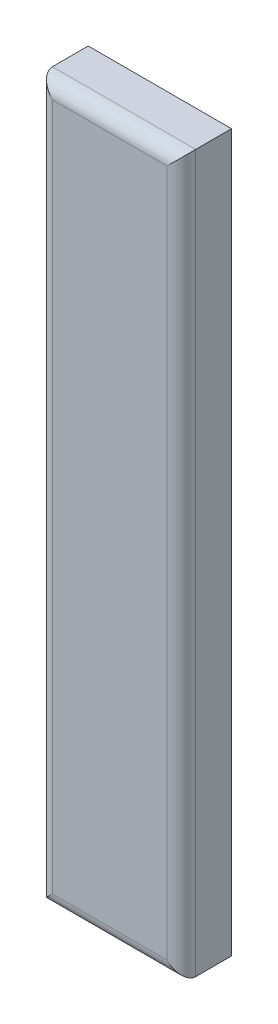
ISO-10303-21;
HEADER;
FILE_DESCRIPTION(('STEP AP214'),'2;1');
FILE_NAME('part.step','',(''),(''),'','','');
FILE_SCHEMA(('AUTOMOTIVE_DESIGN { 1 0 10303 214 1 1 1 1 }'));
ENDSEC;
DATA;
#1=APPLICATION_CONTEXT('core data for automotive mechanical design processes');
#2=APPLICATION_PROTOCOL_DEFINITION('international standard','automotive_design',2000,#1);
#3=PRODUCT_CONTEXT('',#1,'mechanical');
#4=PRODUCT('Part','Part','',(#3));
#5=PRODUCT_RELATED_PRODUCT_CATEGORY('part','',(#4));
#6=PRODUCT_DEFINITION_FORMATION('','',#4);
#7=PRODUCT_DEFINITION_CONTEXT('part definition',#1,'design');
#8=PRODUCT_DEFINITION('design','',#6,#7);
#9=PRODUCT_DEFINITION_SHAPE('','',#8);
#10=(LENGTH_UNIT() NAMED_UNIT(*) SI_UNIT(.MILLI.,.METRE.));
#11=(NAMED_UNIT(*) PLANE_ANGLE_UNIT() SI_UNIT($,.RADIAN.));
#12=(NAMED_UNIT(*) SI_UNIT($,.STERADIAN.) SOLID_ANGLE_UNIT());
#13=UNCERTAINTY_MEASURE_WITH_UNIT(LENGTH_MEASURE(1.E-05),#10,'distance_accuracy_value','');
#14=(GEOMETRIC_REPRESENTATION_CONTEXT(3) GLOBAL_UNCERTAINTY_ASSIGNED_CONTEXT((#13)) GLOBAL_UNIT_ASSIGNED_CONTEXT((#10,
#11,#12)) REPRESENTATION_CONTEXT('',''));
#15=CARTESIAN_POINT('',(0.,0.,0.));
#16=DIRECTION('',(0.,0.,1.));
#17=DIRECTION('',(1.,0.,0.));
#18=AXIS2_PLACEMENT_3D('',#15,#16,#17);
#19=CARTESIAN_POINT('',(9.99999999999999,50.,7.));
#20=DIRECTION('',(-1.,0.,0.));
#21=DIRECTION('',(0.,-1.,0.));
#22=AXIS2_PLACEMENT_3D('',#19,#20,#21);
#23=PLANE('',#22);
#24=DIRECTION('',(0.,0.,-1.));
#25=VECTOR('',#24,1.);
#26=CARTESIAN_POINT('',(9.99999999999999,50.,7.));
#27=LINE('',#26,#25);
#28=CARTESIAN_POINT('',(9.99999999999999,50.,5.));
#29=VERTEX_POINT('',#28);
#30=CARTESIAN_POINT('',(9.99999999999999,50.,0.));
#31=VERTEX_POINT('',#30);
#32=EDGE_CURVE('E84',#29,#31,#27,.T.);
#33=ORIENTED_EDGE('',*,*,#32,.F.);
#34=DIRECTION('',(0.,1.,0.));
#35=VECTOR('',#34,1.);
#36=CARTESIAN_POINT('',(10.,-50.,5.));
#37=LINE('',#36,#35);
#38=CARTESIAN_POINT('',(10.,-50.,5.));
#39=VERTEX_POINT('',#38);
#40=EDGE_CURVE('E42',#29,#39,#37,.F.);
#41=ORIENTED_EDGE('',*,*,#40,.T.);
#42=DIRECTION('',(0.,0.,-1.));
#43=VECTOR('',#42,1.);
#44=CARTESIAN_POINT('',(10.,-50.,7.));
#45=LINE('',#44,#43);
#46=CARTESIAN_POINT('',(10.,-50.,0.));
#47=VERTEX_POINT('',#46);
#48=EDGE_CURVE('E101',#39,#47,#45,.T.);
#49=ORIENTED_EDGE('',*,*,#48,.T.);
#50=DIRECTION('',(0.,1.,0.));
#51=VECTOR('',#50,1.);
#52=CARTESIAN_POINT('',(9.99999999999999,50.,0.));
#53=LINE('',#52,#51);
#54=EDGE_CURVE('E97',#47,#31,#53,.T.);
#55=ORIENTED_EDGE('',*,*,#54,.T.);
#56=EDGE_LOOP('',(#33,#41,#49,#55));
#57=FACE_BOUND('',#56,.T.);
#58=ADVANCED_FACE('F33',(#57),#23,.F.);
#59=CARTESIAN_POINT('',(-10.,50.,7.));
#60=DIRECTION('',(0.,-1.,0.));
#61=DIRECTION('',(0.,0.,-1.));
#62=AXIS2_PLACEMENT_3D('',#59,#60,#61);
#63=PLANE('',#62);
#64=DIRECTION('',(0.,0.,-1.));
#65=VECTOR('',#64,1.);
#66=CARTESIAN_POINT('',(-10.,50.,7.));
#67=LINE('',#66,#65);
#68=CARTESIAN_POINT('',(-10.,50.,5.));
#69=VERTEX_POINT('',#68);
#70=CARTESIAN_POINT('',(-10.,50.,0.));
#71=VERTEX_POINT('',#70);
#72=EDGE_CURVE('E91',#69,#71,#67,.T.);
#73=ORIENTED_EDGE('',*,*,#72,.F.);
#74=DIRECTION('',(-1.,0.,0.));
#75=VECTOR('',#74,1.);
#76=CARTESIAN_POINT('',(9.99999999999999,50.,5.));
#77=LINE('',#76,#75);
#78=EDGE_CURVE('E11',#69,#29,#77,.F.);
#79=ORIENTED_EDGE('',*,*,#78,.T.);
#80=ORIENTED_EDGE('',*,*,#32,.T.);
#81=DIRECTION('',(-1.,0.,0.));
#82=VECTOR('',#81,1.);
#83=CARTESIAN_POINT('',(-10.,50.,0.));
#84=LINE('',#83,#82);
#85=EDGE_CURVE('E87',#31,#71,#84,.T.);
#86=ORIENTED_EDGE('',*,*,#85,.T.);
#87=EDGE_LOOP('',(#73,#79,#80,#86));
#88=FACE_BOUND('',#87,.T.);
#89=ADVANCED_FACE('F86',(#88),#63,.F.);
#90=CARTESIAN_POINT('',(-10.,50.,7.));
#91=DIRECTION('',(1.,0.,0.));
#92=DIRECTION('',(0.,1.,0.));
#93=AXIS2_PLACEMENT_3D('',#90,#91,#92);
#94=PLANE('',#93);
#95=DIRECTION('',(0.,0.,-1.));
#96=VECTOR('',#95,1.);
#97=CARTESIAN_POINT('',(-9.99999999999999,-50.,7.));
#98=LINE('',#97,#96);
#99=CARTESIAN_POINT('',(-9.99999999999999,-50.,5.));
#100=VERTEX_POINT('',#99);
#101=CARTESIAN_POINT('',(-9.99999999999999,-50.,0.));
#102=VERTEX_POINT('',#101);
#103=EDGE_CURVE('E111',#100,#102,#98,.T.);
#104=ORIENTED_EDGE('',*,*,#103,.F.);
#105=DIRECTION('',(0.,-1.,0.));
#106=VECTOR('',#105,1.);
#107=CARTESIAN_POINT('',(-10.,50.,5.));
#108=LINE('',#107,#106);
#109=EDGE_CURVE('E122',#100,#69,#108,.F.);
#110=ORIENTED_EDGE('',*,*,#109,.T.);
#111=ORIENTED_EDGE('',*,*,#72,.T.);
#112=DIRECTION('',(0.,-1.,0.));
#113=VECTOR('',#112,1.);
#114=CARTESIAN_POINT('',(-10.,50.,0.));
#115=LINE('',#114,#113);
#116=EDGE_CURVE('E99',#71,#102,#115,.T.);
#117=ORIENTED_EDGE('',*,*,#116,.T.);
#118=EDGE_LOOP('',(#104,#110,#111,#117));
#119=FACE_BOUND('',#118,.T.);
#120=ADVANCED_FACE('F151',(#119),#94,.F.);
#121=CARTESIAN_POINT('',(-9.99999999999999,-50.,7.));
#122=DIRECTION('',(0.,1.,0.));
#123=DIRECTION('',(0.,0.,1.));
#124=AXIS2_PLACEMENT_3D('',#121,#122,#123);
#125=PLANE('',#124);
#126=ORIENTED_EDGE('',*,*,#48,.F.);
#127=DIRECTION('',(1.,0.,0.));
#128=VECTOR('',#127,1.);
#129=CARTESIAN_POINT('',(-9.99999999999999,-50.,5.));
#130=LINE('',#129,#128);
#131=EDGE_CURVE('E125',#39,#100,#130,.F.);
#132=ORIENTED_EDGE('',*,*,#131,.T.);
#133=ORIENTED_EDGE('',*,*,#103,.T.);
#134=DIRECTION('',(1.,0.,0.));
#135=VECTOR('',#134,1.);
#136=CARTESIAN_POINT('',(-9.99999999999999,-50.,0.));
#137=LINE('',#136,#135);
#138=EDGE_CURVE('E108',#102,#47,#137,.T.);
#139=ORIENTED_EDGE('',*,*,#138,.T.);
#140=EDGE_LOOP('',(#126,#132,#133,#139));
#141=FACE_BOUND('',#140,.T.);
#142=ADVANCED_FACE('F153',(#141),#125,.F.);
#143=CARTESIAN_POINT('',(0.,0.,7.));
#144=DIRECTION('',(0.,0.,1.));
#145=DIRECTION('',(1.,0.,0.));
#146=AXIS2_PLACEMENT_3D('',#143,#144,#145);
#147=PLANE('',#146);
#148=DIRECTION('',(-1.,0.,0.));
#149=VECTOR('',#148,1.);
#150=CARTESIAN_POINT('',(-10.,48.,7.));
#151=LINE('',#150,#149);
#152=CARTESIAN_POINT('',(7.99999999999999,48.,7.));
#153=VERTEX_POINT('',#152);
#154=CARTESIAN_POINT('',(-8.00000000000001,48.,7.));
#155=VERTEX_POINT('',#154);
#156=EDGE_CURVE('E90',#153,#155,#151,.T.);
#157=ORIENTED_EDGE('',*,*,#156,.T.);
#158=DIRECTION('',(0.,-1.,0.));
#159=VECTOR('',#158,1.);
#160=CARTESIAN_POINT('',(-7.99999999999999,-50.,7.));
#161=LINE('',#160,#159);
#162=CARTESIAN_POINT('',(-7.99999999999999,-48.,7.));
#163=VERTEX_POINT('',#162);
#164=EDGE_CURVE('E119',#155,#163,#161,.T.);
#165=ORIENTED_EDGE('',*,*,#164,.T.);
#166=DIRECTION('',(1.,0.,0.));
#167=VECTOR('',#166,1.);
#168=CARTESIAN_POINT('',(10.,-48.,7.));
#169=LINE('',#168,#167);
#170=CARTESIAN_POINT('',(8.,-48.,7.));
#171=VERTEX_POINT('',#170);
#172=EDGE_CURVE('E117',#163,#171,#169,.T.);
#173=ORIENTED_EDGE('',*,*,#172,.T.);
#174=DIRECTION('',(0.,1.,0.));
#175=VECTOR('',#174,1.);
#176=CARTESIAN_POINT('',(7.99999999999999,50.,7.));
#177=LINE('',#176,#175);
#178=EDGE_CURVE('E115',#171,#153,#177,.T.);
#179=ORIENTED_EDGE('',*,*,#178,.T.);
#180=EDGE_LOOP('',(#157,#165,#173,#179));
#181=FACE_BOUND('',#180,.T.);
#182=ADVANCED_FACE('F143',(#181),#147,.T.);
#183=CARTESIAN_POINT('',(0.,0.,0.));
#184=DIRECTION('',(0.,0.,1.));
#185=DIRECTION('',(1.,0.,0.));
#186=AXIS2_PLACEMENT_3D('',#183,#184,#185);
#187=PLANE('',#186);
#188=ORIENTED_EDGE('',*,*,#54,.F.);
#189=ORIENTED_EDGE('',*,*,#138,.F.);
#190=ORIENTED_EDGE('',*,*,#116,.F.);
#191=ORIENTED_EDGE('',*,*,#85,.F.);
#192=EDGE_LOOP('',(#188,#189,#190,#191));
#193=FACE_BOUND('',#192,.T.);
#194=ADVANCED_FACE('F95',(#193),#187,.F.);
#195=CARTESIAN_POINT('',(7.99999999999999,0.,5.));
#196=DIRECTION('',(0.,-1.,0.));
#197=DIRECTION('',(1.,0.,0.));
#198=AXIS2_PLACEMENT_3D('',#195,#196,#197);
#199=CYLINDRICAL_SURFACE('',#198,2.);
#200=CARTESIAN_POINT('',(8.,-48.,5.));
#201=DIRECTION('',(-0.707106781186547,-0.707106781186548,0.));
#202=DIRECTION('',(0.707106781186548,-0.707106781186547,0.));
#203=AXIS2_PLACEMENT_3D('',#200,#201,#202);
#204=ELLIPSE('',#203,2.82842712474619,2.);
#205=EDGE_CURVE('E105',#39,#171,#204,.T.);
#206=ORIENTED_EDGE('',*,*,#205,.F.);
#207=ORIENTED_EDGE('',*,*,#40,.F.);
#208=CARTESIAN_POINT('',(7.99999999999999,48.,5.));
#209=DIRECTION('',(0.707106781186548,-0.707106781186547,0.));
#210=DIRECTION('',(0.707106781186547,0.707106781186548,0.));
#211=AXIS2_PLACEMENT_3D('',#208,#209,#210);
#212=ELLIPSE('',#211,2.82842712474619,2.);
#213=EDGE_CURVE('E37',#153,#29,#212,.F.);
#214=ORIENTED_EDGE('',*,*,#213,.F.);
#215=ORIENTED_EDGE('',*,*,#178,.F.);
#216=EDGE_LOOP('',(#206,#207,#214,#215));
#217=FACE_BOUND('',#216,.T.);
#218=ADVANCED_FACE('F35',(#217),#199,.T.);
#219=CARTESIAN_POINT('',(0.,48.,5.));
#220=DIRECTION('',(1.,0.,0.));
#221=DIRECTION('',(0.,0.,-1.));
#222=AXIS2_PLACEMENT_3D('',#219,#220,#221);
#223=CYLINDRICAL_SURFACE('',#222,2.);
#224=ORIENTED_EDGE('',*,*,#213,.T.);
#225=ORIENTED_EDGE('',*,*,#78,.F.);
#226=CARTESIAN_POINT('',(-8.00000000000001,48.,5.));
#227=DIRECTION('',(0.707106781186547,0.707106781186548,0.));
#228=DIRECTION('',(0.707106781186548,-0.707106781186547,0.));
#229=AXIS2_PLACEMENT_3D('',#226,#227,#228);
#230=ELLIPSE('',#229,2.82842712474619,2.);
#231=EDGE_CURVE('E130',#155,#69,#230,.F.);
#232=ORIENTED_EDGE('',*,*,#231,.F.);
#233=ORIENTED_EDGE('',*,*,#156,.F.);
#234=EDGE_LOOP('',(#224,#225,#232,#233));
#235=FACE_BOUND('',#234,.T.);
#236=ADVANCED_FACE('F173',(#235),#223,.T.);
#237=CARTESIAN_POINT('',(0.,-48.,5.));
#238=DIRECTION('',(-1.,0.,0.));
#239=DIRECTION('',(0.,0.,1.));
#240=AXIS2_PLACEMENT_3D('',#237,#238,#239);
#241=CYLINDRICAL_SURFACE('',#240,2.);
#242=ORIENTED_EDGE('',*,*,#205,.T.);
#243=ORIENTED_EDGE('',*,*,#172,.F.);
#244=CARTESIAN_POINT('',(-7.99999999999999,-48.,5.));
#245=DIRECTION('',(-0.707106781186548,0.707106781186547,0.));
#246=DIRECTION('',(-0.707106781186547,-0.707106781186548,0.));
#247=AXIS2_PLACEMENT_3D('',#244,#245,#246);
#248=ELLIPSE('',#247,2.82842712474619,2.);
#249=EDGE_CURVE('E128',#100,#163,#248,.T.);
#250=ORIENTED_EDGE('',*,*,#249,.F.);
#251=ORIENTED_EDGE('',*,*,#131,.F.);
#252=EDGE_LOOP('',(#242,#243,#250,#251));
#253=FACE_BOUND('',#252,.T.);
#254=ADVANCED_FACE('F136',(#253),#241,.T.);
#255=CARTESIAN_POINT('',(-8.,0.,5.));
#256=DIRECTION('',(0.,1.,0.));
#257=DIRECTION('',(-1.,0.,0.));
#258=AXIS2_PLACEMENT_3D('',#255,#256,#257);
#259=CYLINDRICAL_SURFACE('',#258,2.);
#260=ORIENTED_EDGE('',*,*,#231,.T.);
#261=ORIENTED_EDGE('',*,*,#109,.F.);
#262=ORIENTED_EDGE('',*,*,#249,.T.);
#263=ORIENTED_EDGE('',*,*,#164,.F.);
#264=EDGE_LOOP('',(#260,#261,#262,#263));
#265=FACE_BOUND('',#264,.T.);
#266=ADVANCED_FACE('F147',(#265),#259,.T.);
#267=CLOSED_SHELL('',(#58,#89,#120,#142,#182,#194,#218,#236,#254,#266));
#268=MANIFOLD_SOLID_BREP('B2',#267);
#269=ADVANCED_BREP_SHAPE_REPRESENTATION('',(#18,#268),#14);
#270=SHAPE_DEFINITION_REPRESENTATION(#9,#269);
ENDSEC;
END-ISO-10303-21;
